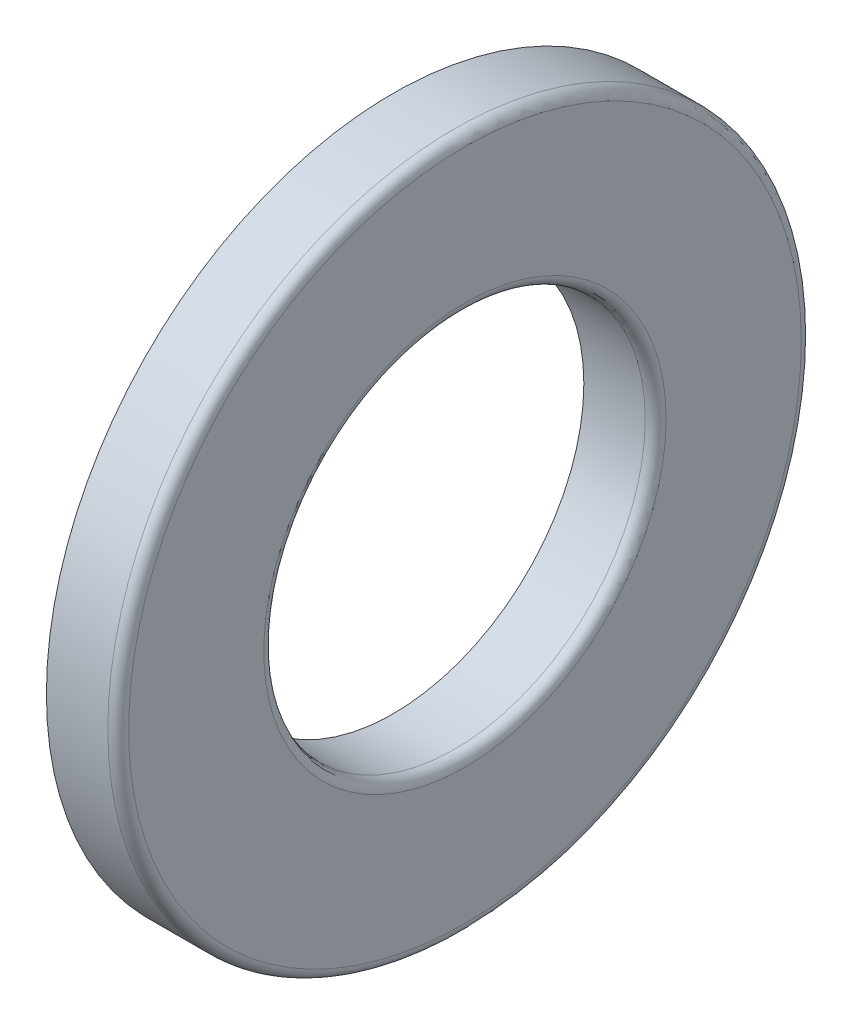
ISO-10303-21;
HEADER;
FILE_DESCRIPTION(('STEP AP214'),'2;1');
FILE_NAME('part.step','',(''),(''),'','','');
FILE_SCHEMA(('AUTOMOTIVE_DESIGN { 1 0 10303 214 1 1 1 1 }'));
ENDSEC;
DATA;
#1=APPLICATION_CONTEXT('core data for automotive mechanical design processes');
#2=APPLICATION_PROTOCOL_DEFINITION('international standard','automotive_design',2000,#1);
#3=PRODUCT_CONTEXT('',#1,'mechanical');
#4=PRODUCT('Part','Part','',(#3));
#5=PRODUCT_RELATED_PRODUCT_CATEGORY('part','',(#4));
#6=PRODUCT_DEFINITION_FORMATION('','',#4);
#7=PRODUCT_DEFINITION_CONTEXT('part definition',#1,'design');
#8=PRODUCT_DEFINITION('design','',#6,#7);
#9=PRODUCT_DEFINITION_SHAPE('','',#8);
#10=(LENGTH_UNIT() NAMED_UNIT(*) SI_UNIT(.MILLI.,.METRE.));
#11=(NAMED_UNIT(*) PLANE_ANGLE_UNIT() SI_UNIT($,.RADIAN.));
#12=(NAMED_UNIT(*) SI_UNIT($,.STERADIAN.) SOLID_ANGLE_UNIT());
#13=UNCERTAINTY_MEASURE_WITH_UNIT(LENGTH_MEASURE(1.E-05),#10,'distance_accuracy_value','');
#14=(GEOMETRIC_REPRESENTATION_CONTEXT(3) GLOBAL_UNCERTAINTY_ASSIGNED_CONTEXT((#13)) GLOBAL_UNIT_ASSIGNED_CONTEXT((#10,
#11,#12)) REPRESENTATION_CONTEXT('',''));
#15=CARTESIAN_POINT('',(0.,0.,0.));
#16=DIRECTION('',(0.,0.,1.));
#17=DIRECTION('',(1.,0.,0.));
#18=AXIS2_PLACEMENT_3D('',#15,#16,#17);
#19=CARTESIAN_POINT('',(9.858,12.857333437046,0.));
#20=DIRECTION('',(-1.,0.,0.));
#21=DIRECTION('',(0.,0.,1.));
#22=AXIS2_PLACEMENT_3D('',#19,#20,#21);
#23=PLANE('',#22);
#24=CARTESIAN_POINT('',(9.858,0.,0.));
#25=DIRECTION('',(1.,0.,0.));
#26=DIRECTION('',(0.,0.,-1.));
#27=AXIS2_PLACEMENT_3D('',#24,#25,#26);
#28=CIRCLE('',#27,11.);
#29=CARTESIAN_POINT('',(9.858,0.,-11.));
#30=VERTEX_POINT('',#29);
#31=EDGE_CURVE('E10',#30,#30,#28,.T.);
#32=ORIENTED_EDGE('',*,*,#31,.T.);
#33=EDGE_LOOP('',(#32));
#34=FACE_BOUND('',#33,.T.);
#35=CARTESIAN_POINT('',(9.858,0.,0.));
#36=DIRECTION('',(1.,0.,0.));
#37=DIRECTION('',(0.,0.,-1.));
#38=AXIS2_PLACEMENT_3D('',#35,#36,#37);
#39=CIRCLE('',#38,12.857333437046);
#40=CARTESIAN_POINT('',(9.858,0.,-12.857333437046));
#41=VERTEX_POINT('',#40);
#42=EDGE_CURVE('E58',#41,#41,#39,.T.);
#43=ORIENTED_EDGE('',*,*,#42,.F.);
#44=EDGE_LOOP('',(#43));
#45=FACE_BOUND('',#44,.T.);
#46=ADVANCED_FACE('F30',(#34,#45),#23,.T.);
#47=CARTESIAN_POINT('',(13.4,0.,0.));
#48=DIRECTION('',(1.,0.,0.));
#49=DIRECTION('',(0.,0.,-1.));
#50=AXIS2_PLACEMENT_3D('',#47,#48,#49);
#51=CYLINDRICAL_SURFACE('',#50,11.);
#52=CARTESIAN_POINT('',(13.4,0.,0.));
#53=DIRECTION('',(1.,0.,0.));
#54=DIRECTION('',(0.,0.,-1.));
#55=AXIS2_PLACEMENT_3D('',#52,#53,#54);
#56=CIRCLE('',#55,11.);
#57=CARTESIAN_POINT('',(13.4,0.,-11.));
#58=VERTEX_POINT('',#57);
#59=EDGE_CURVE('E36',#58,#58,#56,.T.);
#60=ORIENTED_EDGE('',*,*,#59,.T.);
#61=EDGE_LOOP('',(#60));
#62=FACE_BOUND('',#61,.T.);
#63=ORIENTED_EDGE('',*,*,#31,.F.);
#64=EDGE_LOOP('',(#63));
#65=FACE_BOUND('',#64,.T.);
#66=ADVANCED_FACE('F66',(#62,#65),#51,.F.);
#67=CARTESIAN_POINT('',(13.4000000000002,0.,0.));
#68=DIRECTION('',(1.,0.,0.));
#69=DIRECTION('',(0.,0.,-1.));
#70=AXIS2_PLACEMENT_3D('',#67,#68,#69);
#71=TOROIDAL_SURFACE('',#70,11.5999999999998,0.599999999999761);
#72=CARTESIAN_POINT('',(14.,0.,0.));
#73=DIRECTION('',(1.,0.,0.));
#74=DIRECTION('',(0.,0.,-1.));
#75=AXIS2_PLACEMENT_3D('',#72,#73,#74);
#76=CIRCLE('',#75,11.6);
#77=CARTESIAN_POINT('',(14.,0.,-11.6));
#78=VERTEX_POINT('',#77);
#79=EDGE_CURVE('E40',#78,#78,#76,.T.);
#80=ORIENTED_EDGE('',*,*,#79,.T.);
#81=EDGE_LOOP('',(#80));
#82=FACE_BOUND('',#81,.T.);
#83=ORIENTED_EDGE('',*,*,#59,.F.);
#84=EDGE_LOOP('',(#83));
#85=FACE_BOUND('',#84,.T.);
#86=ADVANCED_FACE('F70',(#82,#85),#71,.T.);
#87=CARTESIAN_POINT('',(14.,11.6,0.));
#88=DIRECTION('',(1.,0.,0.));
#89=DIRECTION('',(0.,0.,-1.));
#90=AXIS2_PLACEMENT_3D('',#87,#88,#89);
#91=PLANE('',#90);
#92=CARTESIAN_POINT('',(14.,0.,0.));
#93=DIRECTION('',(1.,0.,0.));
#94=DIRECTION('',(0.,0.,-1.));
#95=AXIS2_PLACEMENT_3D('',#92,#93,#94);
#96=CIRCLE('',#95,19.4);
#97=CARTESIAN_POINT('',(14.,0.,-19.4));
#98=VERTEX_POINT('',#97);
#99=EDGE_CURVE('E44',#98,#98,#96,.T.);
#100=ORIENTED_EDGE('',*,*,#99,.T.);
#101=EDGE_LOOP('',(#100));
#102=FACE_BOUND('',#101,.T.);
#103=ORIENTED_EDGE('',*,*,#79,.F.);
#104=EDGE_LOOP('',(#103));
#105=FACE_BOUND('',#104,.T.);
#106=ADVANCED_FACE('F74',(#102,#105),#91,.T.);
#107=CARTESIAN_POINT('',(13.4000000000002,0.,0.));
#108=DIRECTION('',(1.,0.,0.));
#109=DIRECTION('',(0.,0.,-1.));
#110=AXIS2_PLACEMENT_3D('',#107,#108,#109);
#111=TOROIDAL_SURFACE('',#110,19.4000000000002,0.599999999999758);
#112=CARTESIAN_POINT('',(13.4,0.,0.));
#113=DIRECTION('',(1.,0.,0.));
#114=DIRECTION('',(0.,0.,-1.));
#115=AXIS2_PLACEMENT_3D('',#112,#113,#114);
#116=CIRCLE('',#115,20.);
#117=CARTESIAN_POINT('',(13.4,0.,-20.));
#118=VERTEX_POINT('',#117);
#119=EDGE_CURVE('E49',#118,#118,#116,.T.);
#120=ORIENTED_EDGE('',*,*,#119,.T.);
#121=EDGE_LOOP('',(#120));
#122=FACE_BOUND('',#121,.T.);
#123=ORIENTED_EDGE('',*,*,#99,.F.);
#124=EDGE_LOOP('',(#123));
#125=FACE_BOUND('',#124,.T.);
#126=ADVANCED_FACE('F81',(#122,#125),#111,.T.);
#127=CARTESIAN_POINT('',(13.4,0.,0.));
#128=DIRECTION('',(1.,0.,0.));
#129=DIRECTION('',(0.,0.,-1.));
#130=AXIS2_PLACEMENT_3D('',#127,#128,#129);
#131=CYLINDRICAL_SURFACE('',#130,20.);
#132=CARTESIAN_POINT('',(9.858,0.,0.));
#133=DIRECTION('',(1.,0.,0.));
#134=DIRECTION('',(0.,0.,-1.));
#135=AXIS2_PLACEMENT_3D('',#132,#133,#134);
#136=CIRCLE('',#135,20.);
#137=CARTESIAN_POINT('',(9.858,0.,-20.));
#138=VERTEX_POINT('',#137);
#139=EDGE_CURVE('E52',#138,#138,#136,.T.);
#140=ORIENTED_EDGE('',*,*,#139,.T.);
#141=EDGE_LOOP('',(#140));
#142=FACE_BOUND('',#141,.T.);
#143=ORIENTED_EDGE('',*,*,#119,.F.);
#144=EDGE_LOOP('',(#143));
#145=FACE_BOUND('',#144,.T.);
#146=ADVANCED_FACE('F85',(#142,#145),#131,.T.);
#147=CARTESIAN_POINT('',(9.858,20.,0.));
#148=DIRECTION('',(-1.,0.,0.));
#149=DIRECTION('',(0.,0.,1.));
#150=AXIS2_PLACEMENT_3D('',#147,#148,#149);
#151=PLANE('',#150);
#152=CARTESIAN_POINT('',(9.858,0.,0.));
#153=DIRECTION('',(1.,0.,0.));
#154=DIRECTION('',(0.,0.,-1.));
#155=AXIS2_PLACEMENT_3D('',#152,#153,#154);
#156=CIRCLE('',#155,17.142666562954);
#157=CARTESIAN_POINT('',(9.858,0.,-17.142666562954));
#158=VERTEX_POINT('',#157);
#159=EDGE_CURVE('E55',#158,#158,#156,.T.);
#160=ORIENTED_EDGE('',*,*,#159,.T.);
#161=EDGE_LOOP('',(#160));
#162=FACE_BOUND('',#161,.T.);
#163=ORIENTED_EDGE('',*,*,#139,.F.);
#164=EDGE_LOOP('',(#163));
#165=FACE_BOUND('',#164,.T.);
#166=ADVANCED_FACE('F89',(#162,#165),#151,.T.);
#167=CARTESIAN_POINT('',(6.99999999999921,0.,0.));
#168=DIRECTION('',(1.,0.,0.));
#169=DIRECTION('',(0.,0.,-1.));
#170=AXIS2_PLACEMENT_3D('',#167,#168,#169);
#171=TOROIDAL_SURFACE('',#170,15.,3.57200000000079);
#172=ORIENTED_EDGE('',*,*,#42,.T.);
#173=EDGE_LOOP('',(#172));
#174=FACE_BOUND('',#173,.T.);
#175=ORIENTED_EDGE('',*,*,#159,.F.);
#176=EDGE_LOOP('',(#175));
#177=FACE_BOUND('',#176,.T.);
#178=ADVANCED_FACE('F62',(#174,#177),#171,.F.);
#179=CLOSED_SHELL('',(#46,#66,#86,#106,#126,#146,#166,#178));
#180=MANIFOLD_SOLID_BREP('B2',#179);
#181=ADVANCED_BREP_SHAPE_REPRESENTATION('',(#18,#180),#14);
#182=SHAPE_DEFINITION_REPRESENTATION(#9,#181);
ENDSEC;
END-ISO-10303-21;
